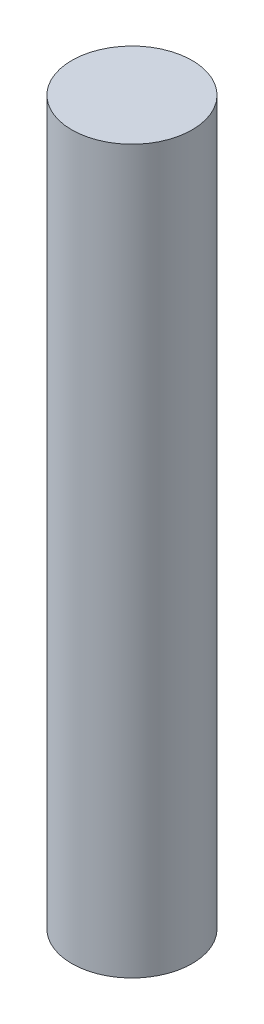
ISO-10303-21;
HEADER;
FILE_DESCRIPTION(('STEP AP214'),'2;1');
FILE_NAME('part.step','',(''),(''),'','','');
FILE_SCHEMA(('AUTOMOTIVE_DESIGN { 1 0 10303 214 1 1 1 1 }'));
ENDSEC;
DATA;
#1=APPLICATION_CONTEXT('core data for automotive mechanical design processes');
#2=APPLICATION_PROTOCOL_DEFINITION('international standard','automotive_design',2000,#1);
#3=PRODUCT_CONTEXT('',#1,'mechanical');
#4=PRODUCT('Part','Part','',(#3));
#5=PRODUCT_RELATED_PRODUCT_CATEGORY('part','',(#4));
#6=PRODUCT_DEFINITION_FORMATION('','',#4);
#7=PRODUCT_DEFINITION_CONTEXT('part definition',#1,'design');
#8=PRODUCT_DEFINITION('design','',#6,#7);
#9=PRODUCT_DEFINITION_SHAPE('','',#8);
#10=(LENGTH_UNIT() NAMED_UNIT(*) SI_UNIT(.MILLI.,.METRE.));
#11=(NAMED_UNIT(*) PLANE_ANGLE_UNIT() SI_UNIT($,.RADIAN.));
#12=(NAMED_UNIT(*) SI_UNIT($,.STERADIAN.) SOLID_ANGLE_UNIT());
#13=UNCERTAINTY_MEASURE_WITH_UNIT(LENGTH_MEASURE(1.E-05),#10,'distance_accuracy_value','');
#14=(GEOMETRIC_REPRESENTATION_CONTEXT(3) GLOBAL_UNCERTAINTY_ASSIGNED_CONTEXT((#13)) GLOBAL_UNIT_ASSIGNED_CONTEXT((#10,
#11,#12)) REPRESENTATION_CONTEXT('',''));
#15=CARTESIAN_POINT('',(0.,0.,0.));
#16=DIRECTION('',(0.,0.,1.));
#17=DIRECTION('',(1.,0.,0.));
#18=AXIS2_PLACEMENT_3D('',#15,#16,#17);
#19=CARTESIAN_POINT('',(0.,300.,0.));
#20=DIRECTION('',(0.,-1.,0.));
#21=DIRECTION('',(0.,0.,-1.));
#22=AXIS2_PLACEMENT_3D('',#19,#20,#21);
#23=CYLINDRICAL_SURFACE('',#22,25.);
#24=CARTESIAN_POINT('',(0.,300.,0.));
#25=DIRECTION('',(0.,1.,0.));
#26=DIRECTION('',(0.,0.,1.));
#27=AXIS2_PLACEMENT_3D('',#24,#25,#26);
#28=CIRCLE('',#27,25.);
#29=CARTESIAN_POINT('',(0.,300.,25.));
#30=VERTEX_POINT('',#29);
#31=EDGE_CURVE('E10',#30,#30,#28,.T.);
#32=ORIENTED_EDGE('',*,*,#31,.F.);
#33=EDGE_LOOP('',(#32));
#34=FACE_BOUND('',#33,.T.);
#35=CARTESIAN_POINT('',(0.,0.,0.));
#36=DIRECTION('',(0.,1.,0.));
#37=DIRECTION('',(0.,0.,1.));
#38=AXIS2_PLACEMENT_3D('',#35,#36,#37);
#39=CIRCLE('',#38,25.);
#40=CARTESIAN_POINT('',(0.,0.,25.));
#41=VERTEX_POINT('',#40);
#42=EDGE_CURVE('E37',#41,#41,#39,.T.);
#43=ORIENTED_EDGE('',*,*,#42,.T.);
#44=EDGE_LOOP('',(#43));
#45=FACE_BOUND('',#44,.T.);
#46=ADVANCED_FACE('F34',(#34,#45),#23,.T.);
#47=CARTESIAN_POINT('',(0.,300.,0.));
#48=DIRECTION('',(0.,1.,0.));
#49=DIRECTION('',(0.,0.,1.));
#50=AXIS2_PLACEMENT_3D('',#47,#48,#49);
#51=PLANE('',#50);
#52=ORIENTED_EDGE('',*,*,#31,.T.);
#53=EDGE_LOOP('',(#52));
#54=FACE_BOUND('',#53,.T.);
#55=ADVANCED_FACE('F49',(#54),#51,.T.);
#56=CARTESIAN_POINT('',(0.,0.,0.));
#57=DIRECTION('',(0.,1.,0.));
#58=DIRECTION('',(0.,0.,1.));
#59=AXIS2_PLACEMENT_3D('',#56,#57,#58);
#60=PLANE('',#59);
#61=ORIENTED_EDGE('',*,*,#42,.F.);
#62=EDGE_LOOP('',(#61));
#63=FACE_BOUND('',#62,.T.);
#64=ADVANCED_FACE('F47',(#63),#60,.F.);
#65=CLOSED_SHELL('',(#46,#55,#64));
#66=MANIFOLD_SOLID_BREP('B2',#65);
#67=ADVANCED_BREP_SHAPE_REPRESENTATION('',(#18,#66),#14);
#68=SHAPE_DEFINITION_REPRESENTATION(#9,#67);
ENDSEC;
END-ISO-10303-21;
